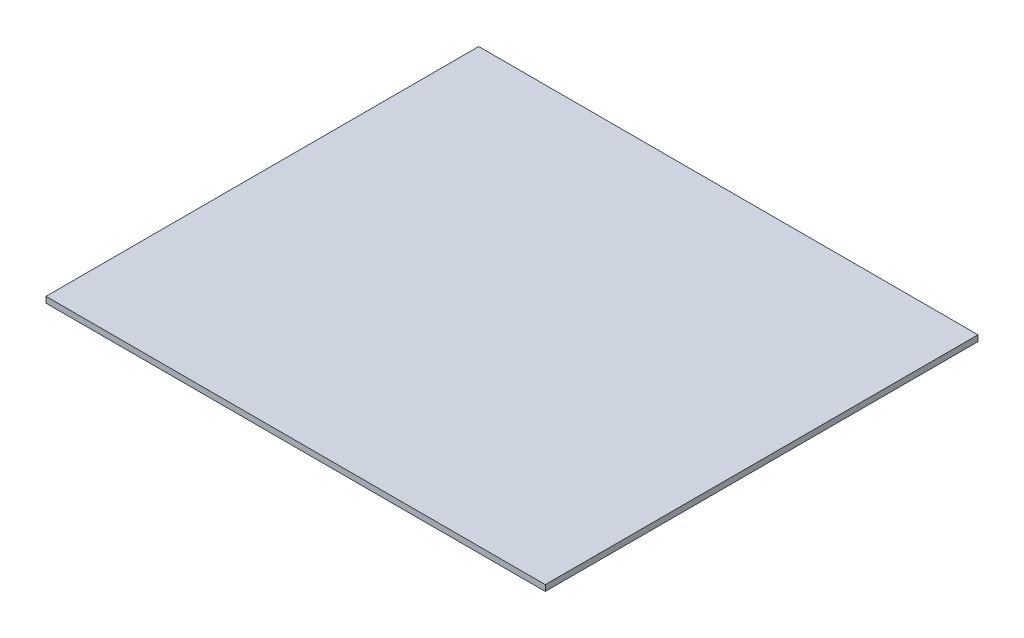
ISO-10303-21;
HEADER;
FILE_DESCRIPTION(('STEP AP214'),'2;1');
FILE_NAME('part.step','',(''),(''),'','','');
FILE_SCHEMA(('AUTOMOTIVE_DESIGN { 1 0 10303 214 1 1 1 1 }'));
ENDSEC;
DATA;
#1=APPLICATION_CONTEXT('core data for automotive mechanical design processes');
#2=APPLICATION_PROTOCOL_DEFINITION('international standard','automotive_design',2000,#1);
#3=PRODUCT_CONTEXT('',#1,'mechanical');
#4=PRODUCT('Part','Part','',(#3));
#5=PRODUCT_RELATED_PRODUCT_CATEGORY('part','',(#4));
#6=PRODUCT_DEFINITION_FORMATION('','',#4);
#7=PRODUCT_DEFINITION_CONTEXT('part definition',#1,'design');
#8=PRODUCT_DEFINITION('design','',#6,#7);
#9=PRODUCT_DEFINITION_SHAPE('','',#8);
#10=(LENGTH_UNIT() NAMED_UNIT(*) SI_UNIT(.MILLI.,.METRE.));
#11=(NAMED_UNIT(*) PLANE_ANGLE_UNIT() SI_UNIT($,.RADIAN.));
#12=(NAMED_UNIT(*) SI_UNIT($,.STERADIAN.) SOLID_ANGLE_UNIT());
#13=UNCERTAINTY_MEASURE_WITH_UNIT(LENGTH_MEASURE(1.E-05),#10,'distance_accuracy_value','');
#14=(GEOMETRIC_REPRESENTATION_CONTEXT(3) GLOBAL_UNCERTAINTY_ASSIGNED_CONTEXT((#13)) GLOBAL_UNIT_ASSIGNED_CONTEXT((#10,
#11,#12)) REPRESENTATION_CONTEXT('',''));
#15=CARTESIAN_POINT('',(0.,0.,0.));
#16=DIRECTION('',(0.,0.,1.));
#17=DIRECTION('',(1.,0.,0.));
#18=AXIS2_PLACEMENT_3D('',#15,#16,#17);
#19=CARTESIAN_POINT('',(0.,20.5000000000001,182.));
#20=DIRECTION('',(0.,-1.,0.));
#21=DIRECTION('',(1.,0.,0.));
#22=AXIS2_PLACEMENT_3D('',#19,#20,#21);
#23=PLANE('',#22);
#24=DIRECTION('',(-1.,0.,0.));
#25=VECTOR('',#24,1.);
#26=CARTESIAN_POINT('',(0.,20.5000000000001,0.));
#27=LINE('',#26,#25);
#28=CARTESIAN_POINT('',(105.,20.5,0.));
#29=VERTEX_POINT('',#28);
#30=CARTESIAN_POINT('',(-105.,20.5,0.));
#31=VERTEX_POINT('',#30);
#32=EDGE_CURVE('E95',#29,#31,#27,.T.);
#33=ORIENTED_EDGE('',*,*,#32,.F.);
#34=DIRECTION('',(0.,0.,-1.));
#35=VECTOR('',#34,1.);
#36=CARTESIAN_POINT('',(105.,20.5,182.));
#37=LINE('',#36,#35);
#38=CARTESIAN_POINT('',(105.,20.5,182.));
#39=VERTEX_POINT('',#38);
#40=EDGE_CURVE('E11',#39,#29,#37,.T.);
#41=ORIENTED_EDGE('',*,*,#40,.F.);
#42=DIRECTION('',(-1.,0.,0.));
#43=VECTOR('',#42,1.);
#44=CARTESIAN_POINT('',(0.,20.5000000000001,182.));
#45=LINE('',#44,#43);
#46=CARTESIAN_POINT('',(-105.,20.5,182.));
#47=VERTEX_POINT('',#46);
#48=EDGE_CURVE('E80',#39,#47,#45,.T.);
#49=ORIENTED_EDGE('',*,*,#48,.T.);
#50=DIRECTION('',(0.,0.,-1.));
#51=VECTOR('',#50,1.);
#52=CARTESIAN_POINT('',(-105.,20.5,182.));
#53=LINE('',#52,#51);
#54=EDGE_CURVE('E48',#47,#31,#53,.T.);
#55=ORIENTED_EDGE('',*,*,#54,.T.);
#56=EDGE_LOOP('',(#33,#41,#49,#55));
#57=FACE_BOUND('',#56,.T.);
#58=ADVANCED_FACE('F32',(#57),#23,.T.);
#59=CARTESIAN_POINT('',(105.,0.,182.));
#60=DIRECTION('',(-1.,0.,0.));
#61=DIRECTION('',(0.,0.,1.));
#62=AXIS2_PLACEMENT_3D('',#59,#60,#61);
#63=PLANE('',#62);
#64=DIRECTION('',(0.,1.,0.));
#65=VECTOR('',#64,1.);
#66=CARTESIAN_POINT('',(105.,0.,0.));
#67=LINE('',#66,#65);
#68=CARTESIAN_POINT('',(105.,23.,0.));
#69=VERTEX_POINT('',#68);
#70=EDGE_CURVE('E86',#29,#69,#67,.T.);
#71=ORIENTED_EDGE('',*,*,#70,.T.);
#72=DIRECTION('',(0.,0.,-1.));
#73=VECTOR('',#72,1.);
#74=CARTESIAN_POINT('',(105.,23.,182.));
#75=LINE('',#74,#73);
#76=CARTESIAN_POINT('',(105.,23.,182.));
#77=VERTEX_POINT('',#76);
#78=EDGE_CURVE('E40',#77,#69,#75,.T.);
#79=ORIENTED_EDGE('',*,*,#78,.F.);
#80=DIRECTION('',(0.,1.,0.));
#81=VECTOR('',#80,1.);
#82=CARTESIAN_POINT('',(105.,0.,182.));
#83=LINE('',#82,#81);
#84=EDGE_CURVE('E74',#39,#77,#83,.T.);
#85=ORIENTED_EDGE('',*,*,#84,.F.);
#86=ORIENTED_EDGE('',*,*,#40,.T.);
#87=EDGE_LOOP('',(#71,#79,#85,#86));
#88=FACE_BOUND('',#87,.T.);
#89=ADVANCED_FACE('F84',(#88),#63,.F.);
#90=CARTESIAN_POINT('',(0.,23.,182.));
#91=DIRECTION('',(0.,1.,0.));
#92=DIRECTION('',(0.,0.,1.));
#93=AXIS2_PLACEMENT_3D('',#90,#91,#92);
#94=PLANE('',#93);
#95=DIRECTION('',(1.,0.,0.));
#96=VECTOR('',#95,1.);
#97=CARTESIAN_POINT('',(0.,23.,0.));
#98=LINE('',#97,#96);
#99=CARTESIAN_POINT('',(-105.,23.,0.));
#100=VERTEX_POINT('',#99);
#101=EDGE_CURVE('E98',#100,#69,#98,.T.);
#102=ORIENTED_EDGE('',*,*,#101,.F.);
#103=DIRECTION('',(0.,0.,-1.));
#104=VECTOR('',#103,1.);
#105=CARTESIAN_POINT('',(-105.,23.,182.));
#106=LINE('',#105,#104);
#107=CARTESIAN_POINT('',(-105.,23.,182.));
#108=VERTEX_POINT('',#107);
#109=EDGE_CURVE('E61',#108,#100,#106,.T.);
#110=ORIENTED_EDGE('',*,*,#109,.F.);
#111=DIRECTION('',(1.,0.,0.));
#112=VECTOR('',#111,1.);
#113=CARTESIAN_POINT('',(0.,23.,182.));
#114=LINE('',#113,#112);
#115=EDGE_CURVE('E79',#108,#77,#114,.T.);
#116=ORIENTED_EDGE('',*,*,#115,.T.);
#117=ORIENTED_EDGE('',*,*,#78,.T.);
#118=EDGE_LOOP('',(#102,#110,#116,#117));
#119=FACE_BOUND('',#118,.T.);
#120=ADVANCED_FACE('F89',(#119),#94,.T.);
#121=CARTESIAN_POINT('',(-105.,0.,182.));
#122=DIRECTION('',(-1.,0.,0.));
#123=DIRECTION('',(0.,0.,1.));
#124=AXIS2_PLACEMENT_3D('',#121,#122,#123);
#125=PLANE('',#124);
#126=DIRECTION('',(0.,1.,0.));
#127=VECTOR('',#126,1.);
#128=CARTESIAN_POINT('',(-105.,0.,0.));
#129=LINE('',#128,#127);
#130=EDGE_CURVE('E100',#31,#100,#129,.T.);
#131=ORIENTED_EDGE('',*,*,#130,.F.);
#132=ORIENTED_EDGE('',*,*,#54,.F.);
#133=DIRECTION('',(0.,1.,0.));
#134=VECTOR('',#133,1.);
#135=CARTESIAN_POINT('',(-105.,0.,182.));
#136=LINE('',#135,#134);
#137=EDGE_CURVE('E90',#47,#108,#136,.T.);
#138=ORIENTED_EDGE('',*,*,#137,.T.);
#139=ORIENTED_EDGE('',*,*,#109,.T.);
#140=EDGE_LOOP('',(#131,#132,#138,#139));
#141=FACE_BOUND('',#140,.T.);
#142=ADVANCED_FACE('F105',(#141),#125,.T.);
#143=CARTESIAN_POINT('',(0.,0.,182.));
#144=DIRECTION('',(0.,0.,1.));
#145=DIRECTION('',(1.,0.,0.));
#146=AXIS2_PLACEMENT_3D('',#143,#144,#145);
#147=PLANE('',#146);
#148=ORIENTED_EDGE('',*,*,#48,.F.);
#149=ORIENTED_EDGE('',*,*,#84,.T.);
#150=ORIENTED_EDGE('',*,*,#115,.F.);
#151=ORIENTED_EDGE('',*,*,#137,.F.);
#152=EDGE_LOOP('',(#148,#149,#150,#151));
#153=FACE_BOUND('',#152,.T.);
#154=ADVANCED_FACE('F76',(#153),#147,.T.);
#155=CARTESIAN_POINT('',(0.,0.,0.));
#156=DIRECTION('',(0.,0.,1.));
#157=DIRECTION('',(1.,0.,0.));
#158=AXIS2_PLACEMENT_3D('',#155,#156,#157);
#159=PLANE('',#158);
#160=ORIENTED_EDGE('',*,*,#32,.T.);
#161=ORIENTED_EDGE('',*,*,#130,.T.);
#162=ORIENTED_EDGE('',*,*,#101,.T.);
#163=ORIENTED_EDGE('',*,*,#70,.F.);
#164=EDGE_LOOP('',(#160,#161,#162,#163));
#165=FACE_BOUND('',#164,.T.);
#166=ADVANCED_FACE('F112',(#165),#159,.F.);
#167=CLOSED_SHELL('',(#58,#89,#120,#142,#154,#166));
#168=MANIFOLD_SOLID_BREP('B2',#167);
#169=ADVANCED_BREP_SHAPE_REPRESENTATION('',(#18,#168),#14);
#170=SHAPE_DEFINITION_REPRESENTATION(#9,#169);
ENDSEC;
END-ISO-10303-21;
